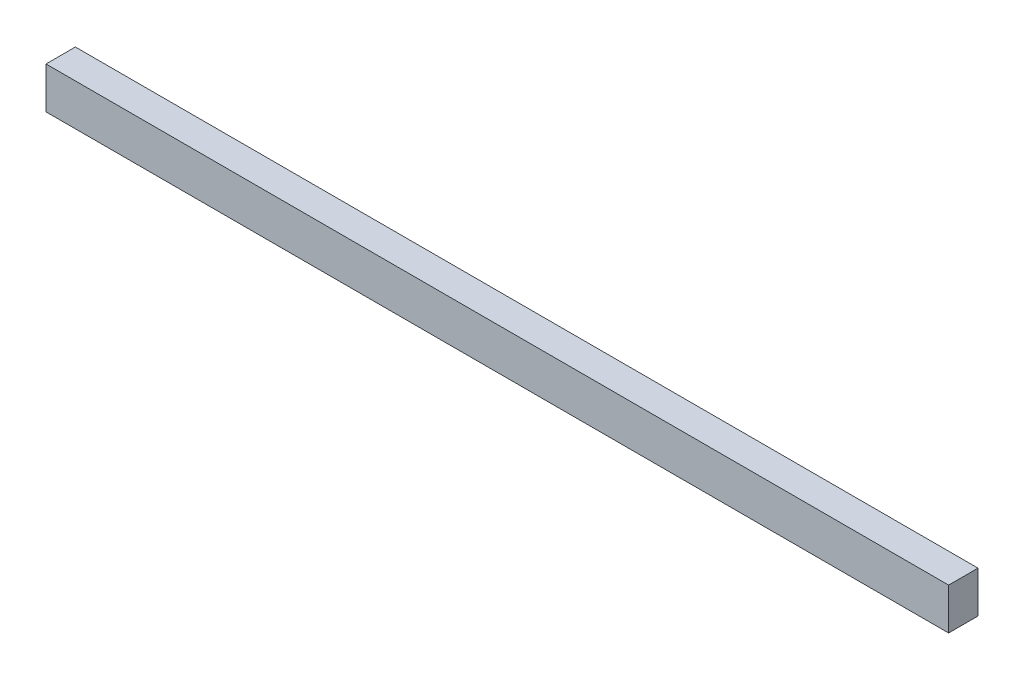
ISO-10303-21;
HEADER;
FILE_DESCRIPTION(('STEP AP214'),'2;1');
FILE_NAME('part.step','',(''),(''),'','','');
FILE_SCHEMA(('AUTOMOTIVE_DESIGN { 1 0 10303 214 1 1 1 1 }'));
ENDSEC;
DATA;
#1=APPLICATION_CONTEXT('core data for automotive mechanical design processes');
#2=APPLICATION_PROTOCOL_DEFINITION('international standard','automotive_design',2000,#1);
#3=PRODUCT_CONTEXT('',#1,'mechanical');
#4=PRODUCT('Part','Part','',(#3));
#5=PRODUCT_RELATED_PRODUCT_CATEGORY('part','',(#4));
#6=PRODUCT_DEFINITION_FORMATION('','',#4);
#7=PRODUCT_DEFINITION_CONTEXT('part definition',#1,'design');
#8=PRODUCT_DEFINITION('design','',#6,#7);
#9=PRODUCT_DEFINITION_SHAPE('','',#8);
#10=(LENGTH_UNIT() NAMED_UNIT(*) SI_UNIT(.MILLI.,.METRE.));
#11=(NAMED_UNIT(*) PLANE_ANGLE_UNIT() SI_UNIT($,.RADIAN.));
#12=(NAMED_UNIT(*) SI_UNIT($,.STERADIAN.) SOLID_ANGLE_UNIT());
#13=UNCERTAINTY_MEASURE_WITH_UNIT(LENGTH_MEASURE(1.E-05),#10,'distance_accuracy_value','');
#14=(GEOMETRIC_REPRESENTATION_CONTEXT(3) GLOBAL_UNCERTAINTY_ASSIGNED_CONTEXT((#13)) GLOBAL_UNIT_ASSIGNED_CONTEXT((#10,
#11,#12)) REPRESENTATION_CONTEXT('',''));
#15=CARTESIAN_POINT('',(0.,0.,0.));
#16=DIRECTION('',(0.,0.,1.));
#17=DIRECTION('',(1.,0.,0.));
#18=AXIS2_PLACEMENT_3D('',#15,#16,#17);
#19=CARTESIAN_POINT('',(-276.225,12.7,17.9832));
#20=DIRECTION('',(1.,0.,0.));
#21=DIRECTION('',(0.,0.,-1.));
#22=AXIS2_PLACEMENT_3D('',#19,#20,#21);
#23=PLANE('',#22);
#24=DIRECTION('',(0.,-1.,0.));
#25=VECTOR('',#24,1.);
#26=CARTESIAN_POINT('',(-276.225,12.7,0.));
#27=LINE('',#26,#25);
#28=CARTESIAN_POINT('',(-276.225,12.7,0.));
#29=VERTEX_POINT('',#28);
#30=CARTESIAN_POINT('',(-276.225,-12.7,0.));
#31=VERTEX_POINT('',#30);
#32=EDGE_CURVE('E98',#29,#31,#27,.T.);
#33=ORIENTED_EDGE('',*,*,#32,.T.);
#34=DIRECTION('',(0.,0.,-1.));
#35=VECTOR('',#34,1.);
#36=CARTESIAN_POINT('',(-276.225,-12.7,17.9832));
#37=LINE('',#36,#35);
#38=CARTESIAN_POINT('',(-276.225,-12.7,17.9832));
#39=VERTEX_POINT('',#38);
#40=EDGE_CURVE('E11',#39,#31,#37,.T.);
#41=ORIENTED_EDGE('',*,*,#40,.F.);
#42=DIRECTION('',(0.,-1.,0.));
#43=VECTOR('',#42,1.);
#44=CARTESIAN_POINT('',(-276.225,12.7,17.9832));
#45=LINE('',#44,#43);
#46=CARTESIAN_POINT('',(-276.225,12.7,17.9832));
#47=VERTEX_POINT('',#46);
#48=EDGE_CURVE('E86',#47,#39,#45,.T.);
#49=ORIENTED_EDGE('',*,*,#48,.F.);
#50=DIRECTION('',(0.,0.,-1.));
#51=VECTOR('',#50,1.);
#52=CARTESIAN_POINT('',(-276.225,12.7,17.9832));
#53=LINE('',#52,#51);
#54=EDGE_CURVE('E94',#47,#29,#53,.T.);
#55=ORIENTED_EDGE('',*,*,#54,.T.);
#56=EDGE_LOOP('',(#33,#41,#49,#55));
#57=FACE_BOUND('',#56,.T.);
#58=ADVANCED_FACE('F35',(#57),#23,.F.);
#59=CARTESIAN_POINT('',(276.225,-12.7,17.9832));
#60=DIRECTION('',(0.,1.,0.));
#61=DIRECTION('',(-1.,0.,0.));
#62=AXIS2_PLACEMENT_3D('',#59,#60,#61);
#63=PLANE('',#62);
#64=DIRECTION('',(1.,0.,0.));
#65=VECTOR('',#64,1.);
#66=CARTESIAN_POINT('',(276.225,-12.7,0.));
#67=LINE('',#66,#65);
#68=CARTESIAN_POINT('',(276.225,-12.7,0.));
#69=VERTEX_POINT('',#68);
#70=EDGE_CURVE('E90',#31,#69,#67,.T.);
#71=ORIENTED_EDGE('',*,*,#70,.T.);
#72=DIRECTION('',(0.,0.,-1.));
#73=VECTOR('',#72,1.);
#74=CARTESIAN_POINT('',(276.225,-12.7,17.9832));
#75=LINE('',#74,#73);
#76=CARTESIAN_POINT('',(276.225,-12.7,17.9832));
#77=VERTEX_POINT('',#76);
#78=EDGE_CURVE('E43',#77,#69,#75,.T.);
#79=ORIENTED_EDGE('',*,*,#78,.F.);
#80=DIRECTION('',(1.,0.,0.));
#81=VECTOR('',#80,1.);
#82=CARTESIAN_POINT('',(276.225,-12.7,17.9832));
#83=LINE('',#82,#81);
#84=EDGE_CURVE('E81',#39,#77,#83,.T.);
#85=ORIENTED_EDGE('',*,*,#84,.F.);
#86=ORIENTED_EDGE('',*,*,#40,.T.);
#87=EDGE_LOOP('',(#71,#79,#85,#86));
#88=FACE_BOUND('',#87,.T.);
#89=ADVANCED_FACE('F89',(#88),#63,.F.);
#90=CARTESIAN_POINT('',(276.225,12.7,17.9832));
#91=DIRECTION('',(-1.,0.,0.));
#92=DIRECTION('',(0.,0.,1.));
#93=AXIS2_PLACEMENT_3D('',#90,#91,#92);
#94=PLANE('',#93);
#95=DIRECTION('',(0.,1.,0.));
#96=VECTOR('',#95,1.);
#97=CARTESIAN_POINT('',(276.225,12.7,0.));
#98=LINE('',#97,#96);
#99=CARTESIAN_POINT('',(276.225,12.7,0.));
#100=VERTEX_POINT('',#99);
#101=EDGE_CURVE('E68',#69,#100,#98,.T.);
#102=ORIENTED_EDGE('',*,*,#101,.T.);
#103=DIRECTION('',(0.,0.,-1.));
#104=VECTOR('',#103,1.);
#105=CARTESIAN_POINT('',(276.225,12.7,17.9832));
#106=LINE('',#105,#104);
#107=CARTESIAN_POINT('',(276.225,12.7,17.9832));
#108=VERTEX_POINT('',#107);
#109=EDGE_CURVE('E91',#108,#100,#106,.T.);
#110=ORIENTED_EDGE('',*,*,#109,.F.);
#111=DIRECTION('',(0.,1.,0.));
#112=VECTOR('',#111,1.);
#113=CARTESIAN_POINT('',(276.225,12.7,17.9832));
#114=LINE('',#113,#112);
#115=EDGE_CURVE('E84',#77,#108,#114,.T.);
#116=ORIENTED_EDGE('',*,*,#115,.F.);
#117=ORIENTED_EDGE('',*,*,#78,.T.);
#118=EDGE_LOOP('',(#102,#110,#116,#117));
#119=FACE_BOUND('',#118,.T.);
#120=ADVANCED_FACE('F92',(#119),#94,.F.);
#121=CARTESIAN_POINT('',(276.225,12.7,17.9832));
#122=DIRECTION('',(0.,-1.,0.));
#123=DIRECTION('',(1.,0.,0.));
#124=AXIS2_PLACEMENT_3D('',#121,#122,#123);
#125=PLANE('',#124);
#126=DIRECTION('',(-1.,0.,0.));
#127=VECTOR('',#126,1.);
#128=CARTESIAN_POINT('',(276.225,12.7,0.));
#129=LINE('',#128,#127);
#130=EDGE_CURVE('E74',#100,#29,#129,.T.);
#131=ORIENTED_EDGE('',*,*,#130,.T.);
#132=ORIENTED_EDGE('',*,*,#54,.F.);
#133=DIRECTION('',(-1.,0.,0.));
#134=VECTOR('',#133,1.);
#135=CARTESIAN_POINT('',(276.225,12.7,17.9832));
#136=LINE('',#135,#134);
#137=EDGE_CURVE('E51',#108,#47,#136,.T.);
#138=ORIENTED_EDGE('',*,*,#137,.F.);
#139=ORIENTED_EDGE('',*,*,#109,.T.);
#140=EDGE_LOOP('',(#131,#132,#138,#139));
#141=FACE_BOUND('',#140,.T.);
#142=ADVANCED_FACE('F105',(#141),#125,.F.);
#143=CARTESIAN_POINT('',(0.,0.,17.9832));
#144=DIRECTION('',(0.,0.,-1.));
#145=DIRECTION('',(-1.,0.,0.));
#146=AXIS2_PLACEMENT_3D('',#143,#144,#145);
#147=PLANE('',#146);
#148=ORIENTED_EDGE('',*,*,#48,.T.);
#149=ORIENTED_EDGE('',*,*,#84,.T.);
#150=ORIENTED_EDGE('',*,*,#115,.T.);
#151=ORIENTED_EDGE('',*,*,#137,.T.);
#152=EDGE_LOOP('',(#148,#149,#150,#151));
#153=FACE_BOUND('',#152,.T.);
#154=ADVANCED_FACE('F82',(#153),#147,.F.);
#155=CARTESIAN_POINT('',(0.,0.,0.));
#156=DIRECTION('',(0.,0.,-1.));
#157=DIRECTION('',(-1.,0.,0.));
#158=AXIS2_PLACEMENT_3D('',#155,#156,#157);
#159=PLANE('',#158);
#160=ORIENTED_EDGE('',*,*,#32,.F.);
#161=ORIENTED_EDGE('',*,*,#130,.F.);
#162=ORIENTED_EDGE('',*,*,#101,.F.);
#163=ORIENTED_EDGE('',*,*,#70,.F.);
#164=EDGE_LOOP('',(#160,#161,#162,#163));
#165=FACE_BOUND('',#164,.T.);
#166=ADVANCED_FACE('F108',(#165),#159,.T.);
#167=CLOSED_SHELL('',(#58,#89,#120,#142,#154,#166));
#168=MANIFOLD_SOLID_BREP('B2',#167);
#169=ADVANCED_BREP_SHAPE_REPRESENTATION('',(#18,#168),#14);
#170=SHAPE_DEFINITION_REPRESENTATION(#9,#169);
ENDSEC;
END-ISO-10303-21;
